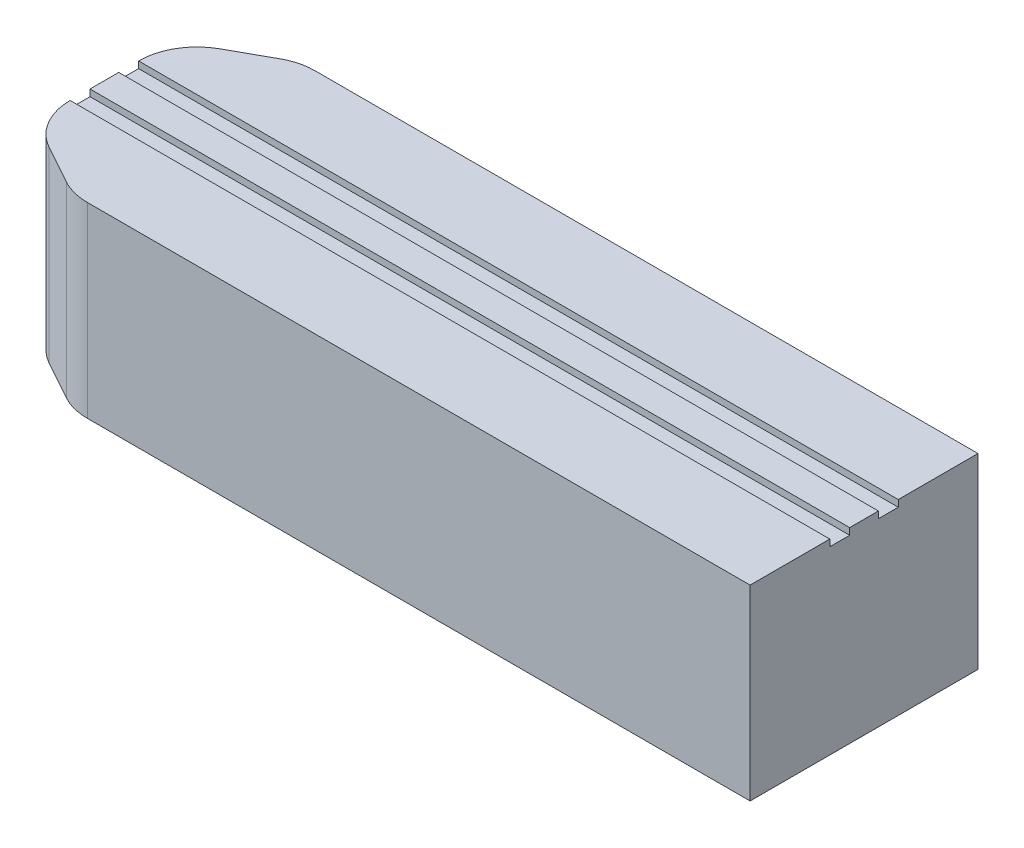
ISO-10303-21;
HEADER;
FILE_DESCRIPTION(('STEP AP214'),'2;1');
FILE_NAME('part.step','',(''),(''),'','','');
FILE_SCHEMA(('AUTOMOTIVE_DESIGN { 1 0 10303 214 1 1 1 1 }'));
ENDSEC;
DATA;
#1=APPLICATION_CONTEXT('core data for automotive mechanical design processes');
#2=APPLICATION_PROTOCOL_DEFINITION('international standard','automotive_design',2000,#1);
#3=PRODUCT_CONTEXT('',#1,'mechanical');
#4=PRODUCT('Part','Part','',(#3));
#5=PRODUCT_RELATED_PRODUCT_CATEGORY('part','',(#4));
#6=PRODUCT_DEFINITION_FORMATION('','',#4);
#7=PRODUCT_DEFINITION_CONTEXT('part definition',#1,'design');
#8=PRODUCT_DEFINITION('design','',#6,#7);
#9=PRODUCT_DEFINITION_SHAPE('','',#8);
#10=(LENGTH_UNIT() NAMED_UNIT(*) SI_UNIT(.MILLI.,.METRE.));
#11=(NAMED_UNIT(*) PLANE_ANGLE_UNIT() SI_UNIT($,.RADIAN.));
#12=(NAMED_UNIT(*) SI_UNIT($,.STERADIAN.) SOLID_ANGLE_UNIT());
#13=UNCERTAINTY_MEASURE_WITH_UNIT(LENGTH_MEASURE(1.E-05),#10,'distance_accuracy_value','');
#14=(GEOMETRIC_REPRESENTATION_CONTEXT(3) GLOBAL_UNCERTAINTY_ASSIGNED_CONTEXT((#13)) GLOBAL_UNIT_ASSIGNED_CONTEXT((#10,
#11,#12)) REPRESENTATION_CONTEXT('',''));
#15=CARTESIAN_POINT('',(0.,0.,0.));
#16=DIRECTION('',(0.,0.,1.));
#17=DIRECTION('',(1.,0.,0.));
#18=AXIS2_PLACEMENT_3D('',#15,#16,#17);
#19=CARTESIAN_POINT('',(0.,16.,0.));
#20=DIRECTION('',(0.,1.,0.));
#21=DIRECTION('',(0.,0.,1.));
#22=AXIS2_PLACEMENT_3D('',#19,#20,#21);
#23=PLANE('',#22);
#24=DIRECTION('',(-1.,0.,0.));
#25=VECTOR('',#24,1.);
#26=CARTESIAN_POINT('',(-26.8688118811881,16.,-3.07394959556729));
#27=LINE('',#26,#25);
#28=CARTESIAN_POINT('',(38.1311881188119,16.,-3.07394959556732));
#29=VERTEX_POINT('',#28);
#30=CARTESIAN_POINT('',(-26.8688118811881,16.,-3.07394959556732));
#31=VERTEX_POINT('',#30);
#32=EDGE_CURVE('E185',#29,#31,#27,.T.);
#33=ORIENTED_EDGE('',*,*,#32,.F.);
#34=DIRECTION('',(0.,0.,-1.));
#35=VECTOR('',#34,1.);
#36=CARTESIAN_POINT('',(38.1311881188119,16.,-9.89480198019802));
#37=LINE('',#36,#35);
#38=CARTESIAN_POINT('',(38.1311881188119,16.,-9.89480198019802));
#39=VERTEX_POINT('',#38);
#40=EDGE_CURVE('E255',#29,#39,#37,.T.);
#41=ORIENTED_EDGE('',*,*,#40,.T.);
#42=DIRECTION('',(-1.,0.,0.));
#43=VECTOR('',#42,1.);
#44=CARTESIAN_POINT('',(-26.8688118811881,16.,-9.89480198019802));
#45=LINE('',#44,#43);
#46=CARTESIAN_POINT('',(-18.5778174324523,16.,-9.89480198019802));
#47=VERTEX_POINT('',#46);
#48=EDGE_CURVE('E260',#39,#47,#45,.T.);
#49=ORIENTED_EDGE('',*,*,#48,.T.);
#50=CARTESIAN_POINT('',(-18.5778174324523,16.,-4.89480198019802));
#51=DIRECTION('',(0.,1.,0.));
#52=DIRECTION('',(0.,0.,1.));
#53=AXIS2_PLACEMENT_3D('',#50,#51,#52);
#54=CIRCLE('',#53,5.);
#55=CARTESIAN_POINT('',(-20.9984320238319,16.,-9.26980198019802));
#56=VERTEX_POINT('',#55);
#57=EDGE_CURVE('E298',#47,#56,#54,.T.);
#58=ORIENTED_EDGE('',*,*,#57,.T.);
#59=DIRECTION('',(-0.875,0.,0.484122918275928));
#60=VECTOR('',#59,1.);
#61=CARTESIAN_POINT('',(-8.84826564376738,16.,-15.9922865578608));
#62=LINE('',#61,#60);
#63=CARTESIAN_POINT('',(-24.2894264725678,16.,-7.44894959556732));
#64=VERTEX_POINT('',#63);
#65=EDGE_CURVE('E237',#56,#64,#62,.T.);
#66=ORIENTED_EDGE('',*,*,#65,.T.);
#67=CARTESIAN_POINT('',(-21.8688118811881,16.,-3.07394959556732));
#68=DIRECTION('',(0.,1.,0.));
#69=DIRECTION('',(0.,0.,1.));
#70=AXIS2_PLACEMENT_3D('',#67,#68,#69);
#71=CIRCLE('',#70,5.);
#72=EDGE_CURVE('E294',#64,#31,#71,.T.);
#73=ORIENTED_EDGE('',*,*,#72,.T.);
#74=EDGE_LOOP('',(#33,#41,#49,#58,#66,#73));
#75=FACE_BOUND('',#74,.T.);
#76=ADVANCED_FACE('F41',(#75),#23,.T.);
#77=DIRECTION('',(1.,0.,0.));
#78=VECTOR('',#77,1.);
#79=CARTESIAN_POINT('',(38.1311881188119,16.,-1.37394959556732));
#80=LINE('',#79,#78);
#81=CARTESIAN_POINT('',(-26.8688118811881,16.,-1.37394959556731));
#82=VERTEX_POINT('',#81);
#83=CARTESIAN_POINT('',(38.1311881188119,16.,-1.37394959556732));
#84=VERTEX_POINT('',#83);
#85=EDGE_CURVE('E222',#82,#84,#80,.T.);
#86=ORIENTED_EDGE('',*,*,#85,.F.);
#87=DIRECTION('',(0.,0.,1.));
#88=VECTOR('',#87,1.);
#89=CARTESIAN_POINT('',(-26.8688118811881,16.,-9.89480198019802));
#90=LINE('',#89,#88);
#91=CARTESIAN_POINT('',(-26.8688118811881,16.,1.08434563517129));
#92=VERTEX_POINT('',#91);
#93=EDGE_CURVE('E191',#82,#92,#90,.T.);
#94=ORIENTED_EDGE('',*,*,#93,.T.);
#95=DIRECTION('',(-1.,0.,0.));
#96=VECTOR('',#95,1.);
#97=CARTESIAN_POINT('',(38.1311881188119,16.,1.08434563517129));
#98=LINE('',#97,#96);
#99=CARTESIAN_POINT('',(38.1311881188119,16.,1.08434563517129));
#100=VERTEX_POINT('',#99);
#101=EDGE_CURVE('E204',#100,#92,#98,.T.);
#102=ORIENTED_EDGE('',*,*,#101,.F.);
#103=EDGE_CURVE('E261',#100,#84,#37,.T.);
#104=ORIENTED_EDGE('',*,*,#103,.T.);
#105=EDGE_LOOP('',(#86,#94,#102,#104));
#106=FACE_BOUND('',#105,.T.);
#107=ADVANCED_FACE('F390',(#106),#23,.T.);
#108=CARTESIAN_POINT('',(-26.8688118811881,16.,-9.89480198019802));
#109=DIRECTION('',(1.,0.,0.));
#110=DIRECTION('',(0.,0.,-1.));
#111=AXIS2_PLACEMENT_3D('',#108,#109,#110);
#112=PLANE('',#111);
#113=ORIENTED_EDGE('',*,*,#93,.F.);
#114=DIRECTION('',(0.,1.,0.));
#115=VECTOR('',#114,1.);
#116=CARTESIAN_POINT('',(-26.8688118811881,15.43,-1.37394959556731));
#117=LINE('',#116,#115);
#118=CARTESIAN_POINT('',(-26.8688118811881,15.43,-1.37394959556731));
#119=VERTEX_POINT('',#118);
#120=EDGE_CURVE('E167',#119,#82,#117,.T.);
#121=ORIENTED_EDGE('',*,*,#120,.F.);
#122=DIRECTION('',(0.,0.,1.));
#123=VECTOR('',#122,1.);
#124=CARTESIAN_POINT('',(-26.8688118811881,15.43,-1.37394959556731));
#125=LINE('',#124,#123);
#126=CARTESIAN_POINT('',(-26.8688118811881,15.43,-3.07394959556729));
#127=VERTEX_POINT('',#126);
#128=EDGE_CURVE('E175',#127,#119,#125,.T.);
#129=ORIENTED_EDGE('',*,*,#128,.F.);
#130=DIRECTION('',(0.,1.,0.));
#131=VECTOR('',#130,1.);
#132=CARTESIAN_POINT('',(-26.8688118811881,0.,-3.07394959556732));
#133=LINE('',#132,#131);
#134=CARTESIAN_POINT('',(-26.8688118811881,0.,-3.07394959556732));
#135=VERTEX_POINT('',#134);
#136=EDGE_CURVE('E323',#127,#135,#133,.F.);
#137=ORIENTED_EDGE('',*,*,#136,.T.);
#138=DIRECTION('',(0.,0.,1.));
#139=VECTOR('',#138,1.);
#140=CARTESIAN_POINT('',(-26.8688118811881,0.,-9.89480198019802));
#141=LINE('',#140,#139);
#142=CARTESIAN_POINT('',(-26.8688118811881,0.,2.78434563517129));
#143=VERTEX_POINT('',#142);
#144=EDGE_CURVE('E236',#135,#143,#141,.T.);
#145=ORIENTED_EDGE('',*,*,#144,.T.);
#146=DIRECTION('',(0.,1.,0.));
#147=VECTOR('',#146,1.);
#148=CARTESIAN_POINT('',(-26.8688118811881,16.,2.78434563517129));
#149=LINE('',#148,#147);
#150=CARTESIAN_POINT('',(-26.8688118811881,15.43,2.78434563517129));
#151=VERTEX_POINT('',#150);
#152=EDGE_CURVE('E319',#143,#151,#149,.T.);
#153=ORIENTED_EDGE('',*,*,#152,.T.);
#154=DIRECTION('',(0.,0.,1.));
#155=VECTOR('',#154,1.);
#156=CARTESIAN_POINT('',(-26.8688118811881,15.43,1.08434563517129));
#157=LINE('',#156,#155);
#158=CARTESIAN_POINT('',(-26.8688118811881,15.43,1.08434563517129));
#159=VERTEX_POINT('',#158);
#160=EDGE_CURVE('E57',#159,#151,#157,.T.);
#161=ORIENTED_EDGE('',*,*,#160,.F.);
#162=DIRECTION('',(0.,1.,0.));
#163=VECTOR('',#162,1.);
#164=CARTESIAN_POINT('',(-26.8688118811881,15.43,1.08434563517129));
#165=LINE('',#164,#163);
#166=EDGE_CURVE('E219',#159,#92,#165,.T.);
#167=ORIENTED_EDGE('',*,*,#166,.T.);
#168=EDGE_LOOP('',(#113,#121,#129,#137,#145,#153,#161,#167));
#169=FACE_BOUND('',#168,.T.);
#170=ADVANCED_FACE('F188',(#169),#112,.F.);
#171=CARTESIAN_POINT('',(-26.8688118811881,16.,9.60519801980198));
#172=DIRECTION('',(0.,0.,-1.));
#173=DIRECTION('',(-1.,0.,0.));
#174=AXIS2_PLACEMENT_3D('',#171,#172,#173);
#175=PLANE('',#174);
#176=DIRECTION('',(1.,0.,0.));
#177=VECTOR('',#176,1.);
#178=CARTESIAN_POINT('',(-26.8688118811881,16.,9.60519801980198));
#179=LINE('',#178,#177);
#180=CARTESIAN_POINT('',(-18.5778174324523,16.,9.60519801980198));
#181=VERTEX_POINT('',#180);
#182=CARTESIAN_POINT('',(38.1311881188119,16.,9.60519801980198));
#183=VERTEX_POINT('',#182);
#184=EDGE_CURVE('E251',#181,#183,#179,.T.);
#185=ORIENTED_EDGE('',*,*,#184,.F.);
#186=DIRECTION('',(0.,1.,0.));
#187=VECTOR('',#186,1.);
#188=CARTESIAN_POINT('',(-18.5778174324523,0.,9.60519801980198));
#189=LINE('',#188,#187);
#190=CARTESIAN_POINT('',(-18.5778174324523,0.,9.60519801980198));
#191=VERTEX_POINT('',#190);
#192=EDGE_CURVE('E11',#181,#191,#189,.F.);
#193=ORIENTED_EDGE('',*,*,#192,.T.);
#194=DIRECTION('',(1.,0.,0.));
#195=VECTOR('',#194,1.);
#196=CARTESIAN_POINT('',(-26.8688118811881,0.,9.60519801980198));
#197=LINE('',#196,#195);
#198=CARTESIAN_POINT('',(38.1311881188119,0.,9.60519801980198));
#199=VERTEX_POINT('',#198);
#200=EDGE_CURVE('E268',#191,#199,#197,.T.);
#201=ORIENTED_EDGE('',*,*,#200,.T.);
#202=DIRECTION('',(0.,-1.,0.));
#203=VECTOR('',#202,1.);
#204=CARTESIAN_POINT('',(38.1311881188119,16.,9.60519801980198));
#205=LINE('',#204,#203);
#206=EDGE_CURVE('E280',#183,#199,#205,.T.);
#207=ORIENTED_EDGE('',*,*,#206,.F.);
#208=EDGE_LOOP('',(#185,#193,#201,#207));
#209=FACE_BOUND('',#208,.T.);
#210=ADVANCED_FACE('F373',(#209),#175,.F.);
#211=CARTESIAN_POINT('',(-26.8688118811881,16.,-9.89480198019802));
#212=DIRECTION('',(0.,0.,1.));
#213=DIRECTION('',(1.,0.,0.));
#214=AXIS2_PLACEMENT_3D('',#211,#212,#213);
#215=PLANE('',#214);
#216=DIRECTION('',(-1.,0.,0.));
#217=VECTOR('',#216,1.);
#218=CARTESIAN_POINT('',(-26.8688118811881,0.,-9.89480198019802));
#219=LINE('',#218,#217);
#220=CARTESIAN_POINT('',(38.1311881188119,0.,-9.89480198019802));
#221=VERTEX_POINT('',#220);
#222=CARTESIAN_POINT('',(-18.5778174324523,0.,-9.89480198019802));
#223=VERTEX_POINT('',#222);
#224=EDGE_CURVE('E252',#221,#223,#219,.T.);
#225=ORIENTED_EDGE('',*,*,#224,.T.);
#226=DIRECTION('',(0.,1.,0.));
#227=VECTOR('',#226,1.);
#228=CARTESIAN_POINT('',(-18.5778174324523,16.,-9.89480198019802));
#229=LINE('',#228,#227);
#230=EDGE_CURVE('E284',#223,#47,#229,.T.);
#231=ORIENTED_EDGE('',*,*,#230,.T.);
#232=ORIENTED_EDGE('',*,*,#48,.F.);
#233=DIRECTION('',(0.,-1.,0.));
#234=VECTOR('',#233,1.);
#235=CARTESIAN_POINT('',(38.1311881188119,16.,-9.89480198019802));
#236=LINE('',#235,#234);
#237=EDGE_CURVE('E265',#39,#221,#236,.T.);
#238=ORIENTED_EDGE('',*,*,#237,.T.);
#239=EDGE_LOOP('',(#225,#231,#232,#238));
#240=FACE_BOUND('',#239,.T.);
#241=ADVANCED_FACE('F362',(#240),#215,.F.);
#242=DIRECTION('',(1.,0.,0.));
#243=VECTOR('',#242,1.);
#244=CARTESIAN_POINT('',(-26.8688118811881,16.,2.78434563517129));
#245=LINE('',#244,#243);
#246=CARTESIAN_POINT('',(-26.8688118811881,16.,2.78434563517129));
#247=VERTEX_POINT('',#246);
#248=CARTESIAN_POINT('',(38.1311881188119,16.,2.78434563517129));
#249=VERTEX_POINT('',#248);
#250=EDGE_CURVE('E214',#247,#249,#245,.T.);
#251=ORIENTED_EDGE('',*,*,#250,.F.);
#252=CARTESIAN_POINT('',(-21.8688118811881,16.,2.78434563517129));
#253=DIRECTION('',(0.,1.,0.));
#254=DIRECTION('',(0.,0.,1.));
#255=AXIS2_PLACEMENT_3D('',#252,#253,#254);
#256=CIRCLE('',#255,5.);
#257=CARTESIAN_POINT('',(-24.2894264725677,16.,7.1593456351713));
#258=VERTEX_POINT('',#257);
#259=EDGE_CURVE('E291',#247,#258,#256,.T.);
#260=ORIENTED_EDGE('',*,*,#259,.T.);
#261=DIRECTION('',(0.875,0.,0.484122918275927));
#262=VECTOR('',#261,1.);
#263=CARTESIAN_POINT('',(-8.72558721862255,16.,15.7705585256826));
#264=LINE('',#263,#262);
#265=CARTESIAN_POINT('',(-20.9984320238319,16.,8.98019801980198));
#266=VERTEX_POINT('',#265);
#267=EDGE_CURVE('E245',#258,#266,#264,.T.);
#268=ORIENTED_EDGE('',*,*,#267,.T.);
#269=CARTESIAN_POINT('',(-18.5778174324523,16.,4.60519801980198));
#270=DIRECTION('',(0.,1.,0.));
#271=DIRECTION('',(0.,0.,1.));
#272=AXIS2_PLACEMENT_3D('',#269,#270,#271);
#273=CIRCLE('',#272,5.);
#274=EDGE_CURVE('E288',#266,#181,#273,.T.);
#275=ORIENTED_EDGE('',*,*,#274,.T.);
#276=ORIENTED_EDGE('',*,*,#184,.T.);
#277=EDGE_CURVE('E256',#183,#249,#37,.T.);
#278=ORIENTED_EDGE('',*,*,#277,.T.);
#279=EDGE_LOOP('',(#251,#260,#268,#275,#276,#278));
#280=FACE_BOUND('',#279,.T.);
#281=ADVANCED_FACE('F378',(#280),#23,.T.);
#282=CARTESIAN_POINT('',(0.,0.,0.));
#283=DIRECTION('',(0.,1.,0.));
#284=DIRECTION('',(0.,0.,1.));
#285=AXIS2_PLACEMENT_3D('',#282,#283,#284);
#286=PLANE('',#285);
#287=DIRECTION('',(-0.875,0.,0.484122918275928));
#288=VECTOR('',#287,1.);
#289=CARTESIAN_POINT('',(-8.84826564376738,0.,-15.9922865578608));
#290=LINE('',#289,#288);
#291=CARTESIAN_POINT('',(-20.9984320238319,0.,-9.26980198019802));
#292=VERTEX_POINT('',#291);
#293=CARTESIAN_POINT('',(-24.2894264725678,0.,-7.44894959556732));
#294=VERTEX_POINT('',#293);
#295=EDGE_CURVE('E232',#292,#294,#290,.T.);
#296=ORIENTED_EDGE('',*,*,#295,.F.);
#297=CARTESIAN_POINT('',(-18.5778174324523,0.,-4.89480198019802));
#298=DIRECTION('',(0.,1.,0.));
#299=DIRECTION('',(0.,0.,1.));
#300=AXIS2_PLACEMENT_3D('',#297,#298,#299);
#301=CIRCLE('',#300,5.);
#302=EDGE_CURVE('E316',#292,#223,#301,.F.);
#303=ORIENTED_EDGE('',*,*,#302,.T.);
#304=ORIENTED_EDGE('',*,*,#224,.F.);
#305=DIRECTION('',(0.,0.,-1.));
#306=VECTOR('',#305,1.);
#307=CARTESIAN_POINT('',(38.1311881188119,0.,-9.89480198019802));
#308=LINE('',#307,#306);
#309=EDGE_CURVE('E271',#199,#221,#308,.T.);
#310=ORIENTED_EDGE('',*,*,#309,.F.);
#311=ORIENTED_EDGE('',*,*,#200,.F.);
#312=CARTESIAN_POINT('',(-18.5778174324523,0.,4.60519801980198));
#313=DIRECTION('',(0.,1.,0.));
#314=DIRECTION('',(0.,0.,1.));
#315=AXIS2_PLACEMENT_3D('',#312,#313,#314);
#316=CIRCLE('',#315,5.);
#317=CARTESIAN_POINT('',(-20.9984320238319,0.,8.98019801980198));
#318=VERTEX_POINT('',#317);
#319=EDGE_CURVE('E308',#191,#318,#316,.F.);
#320=ORIENTED_EDGE('',*,*,#319,.T.);
#321=DIRECTION('',(0.875,0.,0.484122918275927));
#322=VECTOR('',#321,1.);
#323=CARTESIAN_POINT('',(-8.72558721862255,0.,15.7705585256826));
#324=LINE('',#323,#322);
#325=CARTESIAN_POINT('',(-24.2894264725677,0.,7.1593456351713));
#326=VERTEX_POINT('',#325);
#327=EDGE_CURVE('E241',#326,#318,#324,.T.);
#328=ORIENTED_EDGE('',*,*,#327,.F.);
#329=CARTESIAN_POINT('',(-21.8688118811881,0.,2.78434563517129));
#330=DIRECTION('',(0.,1.,0.));
#331=DIRECTION('',(0.,0.,1.));
#332=AXIS2_PLACEMENT_3D('',#329,#330,#331);
#333=CIRCLE('',#332,5.);
#334=EDGE_CURVE('E65',#326,#143,#333,.F.);
#335=ORIENTED_EDGE('',*,*,#334,.T.);
#336=ORIENTED_EDGE('',*,*,#144,.F.);
#337=CARTESIAN_POINT('',(-21.8688118811881,0.,-3.07394959556732));
#338=DIRECTION('',(0.,1.,0.));
#339=DIRECTION('',(0.,0.,1.));
#340=AXIS2_PLACEMENT_3D('',#337,#338,#339);
#341=CIRCLE('',#340,5.);
#342=EDGE_CURVE('E313',#135,#294,#341,.F.);
#343=ORIENTED_EDGE('',*,*,#342,.T.);
#344=EDGE_LOOP('',(#296,#303,#304,#310,#311,#320,#328,#335,#336,#343));
#345=FACE_BOUND('',#344,.T.);
#346=ADVANCED_FACE('F339',(#345),#286,.F.);
#347=CARTESIAN_POINT('',(38.1311881188119,16.,-9.89480198019802));
#348=DIRECTION('',(-1.,0.,0.));
#349=DIRECTION('',(0.,0.,1.));
#350=AXIS2_PLACEMENT_3D('',#347,#348,#349);
#351=PLANE('',#350);
#352=ORIENTED_EDGE('',*,*,#40,.F.);
#353=DIRECTION('',(0.,1.,0.));
#354=VECTOR('',#353,1.);
#355=CARTESIAN_POINT('',(38.1311881188119,15.43,-3.07394959556732));
#356=LINE('',#355,#354);
#357=CARTESIAN_POINT('',(38.1311881188119,15.43,-3.07394959556732));
#358=VERTEX_POINT('',#357);
#359=EDGE_CURVE('E196',#358,#29,#356,.T.);
#360=ORIENTED_EDGE('',*,*,#359,.F.);
#361=DIRECTION('',(0.,0.,-1.));
#362=VECTOR('',#361,1.);
#363=CARTESIAN_POINT('',(38.1311881188119,15.43,-3.07394959556732));
#364=LINE('',#363,#362);
#365=CARTESIAN_POINT('',(38.1311881188119,15.43,-1.37394959556732));
#366=VERTEX_POINT('',#365);
#367=EDGE_CURVE('E174',#366,#358,#364,.T.);
#368=ORIENTED_EDGE('',*,*,#367,.F.);
#369=DIRECTION('',(0.,1.,0.));
#370=VECTOR('',#369,1.);
#371=CARTESIAN_POINT('',(38.1311881188119,15.43,-1.37394959556732));
#372=LINE('',#371,#370);
#373=EDGE_CURVE('E170',#366,#84,#372,.T.);
#374=ORIENTED_EDGE('',*,*,#373,.T.);
#375=ORIENTED_EDGE('',*,*,#103,.F.);
#376=DIRECTION('',(0.,1.,0.));
#377=VECTOR('',#376,1.);
#378=CARTESIAN_POINT('',(38.1311881188119,15.43,1.08434563517129));
#379=LINE('',#378,#377);
#380=CARTESIAN_POINT('',(38.1311881188119,15.43,1.08434563517129));
#381=VERTEX_POINT('',#380);
#382=EDGE_CURVE('E223',#381,#100,#379,.T.);
#383=ORIENTED_EDGE('',*,*,#382,.F.);
#384=DIRECTION('',(0.,0.,-1.));
#385=VECTOR('',#384,1.);
#386=CARTESIAN_POINT('',(38.1311881188119,15.43,2.78434563517129));
#387=LINE('',#386,#385);
#388=CARTESIAN_POINT('',(38.1311881188119,15.43,2.78434563517129));
#389=VERTEX_POINT('',#388);
#390=EDGE_CURVE('E207',#389,#381,#387,.T.);
#391=ORIENTED_EDGE('',*,*,#390,.F.);
#392=DIRECTION('',(0.,1.,0.));
#393=VECTOR('',#392,1.);
#394=CARTESIAN_POINT('',(38.1311881188119,15.43,2.78434563517129));
#395=LINE('',#394,#393);
#396=EDGE_CURVE('E226',#389,#249,#395,.T.);
#397=ORIENTED_EDGE('',*,*,#396,.T.);
#398=ORIENTED_EDGE('',*,*,#277,.F.);
#399=ORIENTED_EDGE('',*,*,#206,.T.);
#400=ORIENTED_EDGE('',*,*,#309,.T.);
#401=ORIENTED_EDGE('',*,*,#237,.F.);
#402=EDGE_LOOP('',(#352,#360,#368,#374,#375,#383,#391,#397,#398,#399,#400,#401));
#403=FACE_BOUND('',#402,.T.);
#404=ADVANCED_FACE('F368',(#403),#351,.F.);
#405=CARTESIAN_POINT('',(-8.72558721862255,0.,15.7705585256826));
#406=DIRECTION('',(-0.484122918275927,0.,0.875));
#407=DIRECTION('',(0.875,0.,0.484122918275927));
#408=AXIS2_PLACEMENT_3D('',#405,#406,#407);
#409=PLANE('',#408);
#410=ORIENTED_EDGE('',*,*,#267,.F.);
#411=DIRECTION('',(0.,1.,0.));
#412=VECTOR('',#411,1.);
#413=CARTESIAN_POINT('',(-24.2894264725677,0.,7.15934563517129));
#414=LINE('',#413,#412);
#415=EDGE_CURVE('E50',#258,#326,#414,.F.);
#416=ORIENTED_EDGE('',*,*,#415,.T.);
#417=ORIENTED_EDGE('',*,*,#327,.T.);
#418=DIRECTION('',(0.,1.,0.));
#419=VECTOR('',#418,1.);
#420=CARTESIAN_POINT('',(-20.9984320238319,16.,8.98019801980198));
#421=LINE('',#420,#419);
#422=EDGE_CURVE('E327',#318,#266,#421,.T.);
#423=ORIENTED_EDGE('',*,*,#422,.T.);
#424=EDGE_LOOP('',(#410,#416,#417,#423));
#425=FACE_BOUND('',#424,.T.);
#426=ADVANCED_FACE('F334',(#425),#409,.T.);
#427=CARTESIAN_POINT('',(-8.84826564376738,0.,-15.9922865578608));
#428=DIRECTION('',(-0.484122918275928,0.,-0.875));
#429=DIRECTION('',(-0.875,0.,0.484122918275928));
#430=AXIS2_PLACEMENT_3D('',#427,#428,#429);
#431=PLANE('',#430);
#432=ORIENTED_EDGE('',*,*,#65,.F.);
#433=DIRECTION('',(0.,1.,0.));
#434=VECTOR('',#433,1.);
#435=CARTESIAN_POINT('',(-20.9984320238319,0.,-9.26980198019802));
#436=LINE('',#435,#434);
#437=EDGE_CURVE('E305',#56,#292,#436,.F.);
#438=ORIENTED_EDGE('',*,*,#437,.T.);
#439=ORIENTED_EDGE('',*,*,#295,.T.);
#440=DIRECTION('',(0.,1.,0.));
#441=VECTOR('',#440,1.);
#442=CARTESIAN_POINT('',(-24.2894264725678,16.,-7.44894959556732));
#443=LINE('',#442,#441);
#444=EDGE_CURVE('E301',#294,#64,#443,.T.);
#445=ORIENTED_EDGE('',*,*,#444,.T.);
#446=EDGE_LOOP('',(#432,#438,#439,#445));
#447=FACE_BOUND('',#446,.T.);
#448=ADVANCED_FACE('F352',(#447),#431,.T.);
#449=CARTESIAN_POINT('',(-18.5778174324523,16.,-4.89480198019802));
#450=DIRECTION('',(0.,-1.,0.));
#451=DIRECTION('',(0.,0.,-1.));
#452=AXIS2_PLACEMENT_3D('',#449,#450,#451);
#453=CYLINDRICAL_SURFACE('',#452,5.);
#454=ORIENTED_EDGE('',*,*,#302,.F.);
#455=ORIENTED_EDGE('',*,*,#437,.F.);
#456=ORIENTED_EDGE('',*,*,#57,.F.);
#457=ORIENTED_EDGE('',*,*,#230,.F.);
#458=EDGE_LOOP('',(#454,#455,#456,#457));
#459=FACE_BOUND('',#458,.T.);
#460=ADVANCED_FACE('F360',(#459),#453,.T.);
#461=CARTESIAN_POINT('',(-21.8688118811881,0.,-3.07394959556732));
#462=DIRECTION('',(0.,-1.,0.));
#463=DIRECTION('',(0.,0.,-1.));
#464=AXIS2_PLACEMENT_3D('',#461,#462,#463);
#465=CYLINDRICAL_SURFACE('',#464,5.);
#466=ORIENTED_EDGE('',*,*,#342,.F.);
#467=ORIENTED_EDGE('',*,*,#136,.F.);
#468=EDGE_CURVE('E324',#31,#127,#133,.F.);
#469=ORIENTED_EDGE('',*,*,#468,.F.);
#470=ORIENTED_EDGE('',*,*,#72,.F.);
#471=ORIENTED_EDGE('',*,*,#444,.F.);
#472=EDGE_LOOP('',(#466,#467,#469,#470,#471));
#473=FACE_BOUND('',#472,.T.);
#474=ADVANCED_FACE('F348',(#473),#465,.T.);
#475=CARTESIAN_POINT('',(-21.8688118811881,16.,2.78434563517129));
#476=DIRECTION('',(0.,-1.,0.));
#477=DIRECTION('',(0.,0.,-1.));
#478=AXIS2_PLACEMENT_3D('',#475,#476,#477);
#479=CYLINDRICAL_SURFACE('',#478,5.);
#480=ORIENTED_EDGE('',*,*,#334,.F.);
#481=ORIENTED_EDGE('',*,*,#415,.F.);
#482=ORIENTED_EDGE('',*,*,#259,.F.);
#483=DIRECTION('',(0.,1.,0.));
#484=VECTOR('',#483,1.);
#485=CARTESIAN_POINT('',(-26.8688118811881,15.43,2.78434563517129));
#486=LINE('',#485,#484);
#487=EDGE_CURVE('E213',#151,#247,#486,.T.);
#488=ORIENTED_EDGE('',*,*,#487,.F.);
#489=ORIENTED_EDGE('',*,*,#152,.F.);
#490=EDGE_LOOP('',(#480,#481,#482,#488,#489));
#491=FACE_BOUND('',#490,.T.);
#492=ADVANCED_FACE('F343',(#491),#479,.T.);
#493=CARTESIAN_POINT('',(-18.5778174324523,0.,4.60519801980198));
#494=DIRECTION('',(0.,-1.,0.));
#495=DIRECTION('',(0.,0.,-1.));
#496=AXIS2_PLACEMENT_3D('',#493,#494,#495);
#497=CYLINDRICAL_SURFACE('',#496,5.);
#498=ORIENTED_EDGE('',*,*,#319,.F.);
#499=ORIENTED_EDGE('',*,*,#192,.F.);
#500=ORIENTED_EDGE('',*,*,#274,.F.);
#501=ORIENTED_EDGE('',*,*,#422,.F.);
#502=EDGE_LOOP('',(#498,#499,#500,#501));
#503=FACE_BOUND('',#502,.T.);
#504=ADVANCED_FACE('F43',(#503),#497,.T.);
#505=CARTESIAN_POINT('',(38.1311881188119,15.43,1.08434563517129));
#506=DIRECTION('',(0.,0.,-1.));
#507=DIRECTION('',(-1.,0.,0.));
#508=AXIS2_PLACEMENT_3D('',#505,#506,#507);
#509=PLANE('',#508);
#510=ORIENTED_EDGE('',*,*,#101,.T.);
#511=ORIENTED_EDGE('',*,*,#166,.F.);
#512=DIRECTION('',(-1.,0.,0.));
#513=VECTOR('',#512,1.);
#514=CARTESIAN_POINT('',(38.1311881188119,15.43,1.08434563517129));
#515=LINE('',#514,#513);
#516=EDGE_CURVE('E210',#381,#159,#515,.T.);
#517=ORIENTED_EDGE('',*,*,#516,.F.);
#518=ORIENTED_EDGE('',*,*,#382,.T.);
#519=EDGE_LOOP('',(#510,#511,#517,#518));
#520=FACE_BOUND('',#519,.T.);
#521=ADVANCED_FACE('F387',(#520),#509,.F.);
#522=CARTESIAN_POINT('',(-26.8688118811881,15.43,2.78434563517129));
#523=DIRECTION('',(0.,0.,1.));
#524=DIRECTION('',(1.,0.,0.));
#525=AXIS2_PLACEMENT_3D('',#522,#523,#524);
#526=PLANE('',#525);
#527=ORIENTED_EDGE('',*,*,#250,.T.);
#528=ORIENTED_EDGE('',*,*,#396,.F.);
#529=DIRECTION('',(1.,0.,0.));
#530=VECTOR('',#529,1.);
#531=CARTESIAN_POINT('',(-26.8688118811881,15.43,2.78434563517129));
#532=LINE('',#531,#530);
#533=EDGE_CURVE('E203',#151,#389,#532,.T.);
#534=ORIENTED_EDGE('',*,*,#533,.F.);
#535=ORIENTED_EDGE('',*,*,#487,.T.);
#536=EDGE_LOOP('',(#527,#528,#534,#535));
#537=FACE_BOUND('',#536,.T.);
#538=ADVANCED_FACE('F380',(#537),#526,.F.);
#539=CARTESIAN_POINT('',(0.,15.43,0.));
#540=DIRECTION('',(0.,1.,0.));
#541=DIRECTION('',(0.,0.,1.));
#542=AXIS2_PLACEMENT_3D('',#539,#540,#541);
#543=PLANE('',#542);
#544=ORIENTED_EDGE('',*,*,#160,.T.);
#545=ORIENTED_EDGE('',*,*,#533,.T.);
#546=ORIENTED_EDGE('',*,*,#390,.T.);
#547=ORIENTED_EDGE('',*,*,#516,.T.);
#548=EDGE_LOOP('',(#544,#545,#546,#547));
#549=FACE_BOUND('',#548,.T.);
#550=ADVANCED_FACE('F385',(#549),#543,.T.);
#551=CARTESIAN_POINT('',(-26.8688118811881,15.43,-3.07394959556729));
#552=DIRECTION('',(0.,0.,-1.));
#553=DIRECTION('',(-1.,0.,0.));
#554=AXIS2_PLACEMENT_3D('',#551,#552,#553);
#555=PLANE('',#554);
#556=ORIENTED_EDGE('',*,*,#32,.T.);
#557=ORIENTED_EDGE('',*,*,#468,.T.);
#558=DIRECTION('',(-1.,0.,0.));
#559=VECTOR('',#558,1.);
#560=CARTESIAN_POINT('',(-26.8688118811881,15.43,-3.07394959556729));
#561=LINE('',#560,#559);
#562=EDGE_CURVE('E181',#358,#127,#561,.T.);
#563=ORIENTED_EDGE('',*,*,#562,.F.);
#564=ORIENTED_EDGE('',*,*,#359,.T.);
#565=EDGE_LOOP('',(#556,#557,#563,#564));
#566=FACE_BOUND('',#565,.T.);
#567=ADVANCED_FACE('F400',(#566),#555,.F.);
#568=CARTESIAN_POINT('',(38.1311881188119,15.43,-1.37394959556732));
#569=DIRECTION('',(0.,0.,1.));
#570=DIRECTION('',(1.,0.,0.));
#571=AXIS2_PLACEMENT_3D('',#568,#569,#570);
#572=PLANE('',#571);
#573=ORIENTED_EDGE('',*,*,#85,.T.);
#574=ORIENTED_EDGE('',*,*,#373,.F.);
#575=DIRECTION('',(1.,0.,0.));
#576=VECTOR('',#575,1.);
#577=CARTESIAN_POINT('',(38.1311881188119,15.43,-1.37394959556732));
#578=LINE('',#577,#576);
#579=EDGE_CURVE('E163',#119,#366,#578,.T.);
#580=ORIENTED_EDGE('',*,*,#579,.F.);
#581=ORIENTED_EDGE('',*,*,#120,.T.);
#582=EDGE_LOOP('',(#573,#574,#580,#581));
#583=FACE_BOUND('',#582,.T.);
#584=ADVANCED_FACE('F165',(#583),#572,.F.);
#585=CARTESIAN_POINT('',(0.,15.43,0.));
#586=DIRECTION('',(0.,-1.,0.));
#587=DIRECTION('',(0.,0.,-1.));
#588=AXIS2_PLACEMENT_3D('',#585,#586,#587);
#589=PLANE('',#588);
#590=ORIENTED_EDGE('',*,*,#128,.T.);
#591=ORIENTED_EDGE('',*,*,#579,.T.);
#592=ORIENTED_EDGE('',*,*,#367,.T.);
#593=ORIENTED_EDGE('',*,*,#562,.T.);
#594=EDGE_LOOP('',(#590,#591,#592,#593));
#595=FACE_BOUND('',#594,.T.);
#596=ADVANCED_FACE('F179',(#595),#589,.F.);
#597=CLOSED_SHELL('',(#76,#107,#170,#210,#241,#281,#346,#404,#426,#448,#460,#474,#492,#504,#521,
#538,#550,#567,#584,#596));
#598=MANIFOLD_SOLID_BREP('B2',#597);
#599=ADVANCED_BREP_SHAPE_REPRESENTATION('',(#18,#598),#14);
#600=SHAPE_DEFINITION_REPRESENTATION(#9,#599);
ENDSEC;
END-ISO-10303-21;
